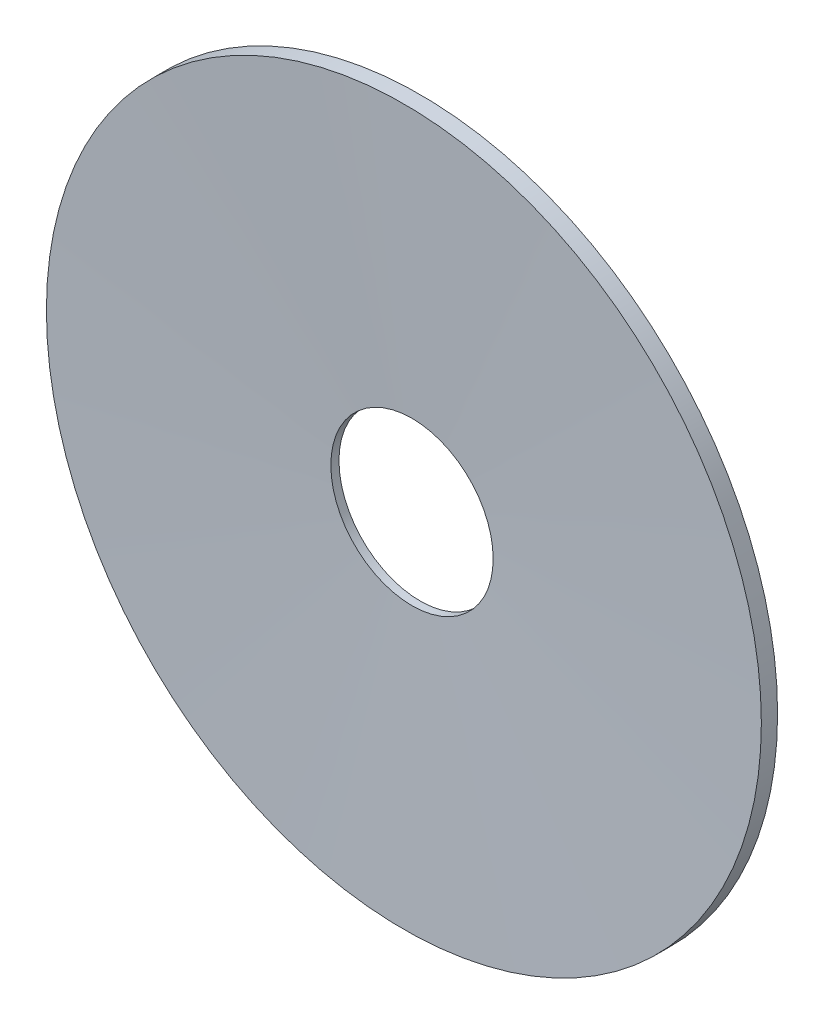
ISO-10303-21;
HEADER;
FILE_DESCRIPTION(('STEP AP214'),'2;1');
FILE_NAME('part.step','',(''),(''),'','','');
FILE_SCHEMA(('AUTOMOTIVE_DESIGN { 1 0 10303 214 1 1 1 1 }'));
ENDSEC;
DATA;
#1=APPLICATION_CONTEXT('core data for automotive mechanical design processes');
#2=APPLICATION_PROTOCOL_DEFINITION('international standard','automotive_design',2000,#1);
#3=PRODUCT_CONTEXT('',#1,'mechanical');
#4=PRODUCT('Part','Part','',(#3));
#5=PRODUCT_RELATED_PRODUCT_CATEGORY('part','',(#4));
#6=PRODUCT_DEFINITION_FORMATION('','',#4);
#7=PRODUCT_DEFINITION_CONTEXT('part definition',#1,'design');
#8=PRODUCT_DEFINITION('design','',#6,#7);
#9=PRODUCT_DEFINITION_SHAPE('','',#8);
#10=(LENGTH_UNIT() NAMED_UNIT(*) SI_UNIT(.MILLI.,.METRE.));
#11=(NAMED_UNIT(*) PLANE_ANGLE_UNIT() SI_UNIT($,.RADIAN.));
#12=(NAMED_UNIT(*) SI_UNIT($,.STERADIAN.) SOLID_ANGLE_UNIT());
#13=UNCERTAINTY_MEASURE_WITH_UNIT(LENGTH_MEASURE(1.E-05),#10,'distance_accuracy_value','');
#14=(GEOMETRIC_REPRESENTATION_CONTEXT(3) GLOBAL_UNCERTAINTY_ASSIGNED_CONTEXT((#13)) GLOBAL_UNIT_ASSIGNED_CONTEXT((#10,
#11,#12)) REPRESENTATION_CONTEXT('',''));
#15=CARTESIAN_POINT('',(0.,0.,0.));
#16=DIRECTION('',(0.,0.,1.));
#17=DIRECTION('',(1.,0.,0.));
#18=AXIS2_PLACEMENT_3D('',#15,#16,#17);
#19=CARTESIAN_POINT('',(0.,0.,4.));
#20=DIRECTION('',(0.,0.,-1.));
#21=DIRECTION('',(-1.,0.,0.));
#22=AXIS2_PLACEMENT_3D('',#19,#20,#21);
#23=CYLINDRICAL_SURFACE('',#22,88.1);
#24=CARTESIAN_POINT('',(0.,0.,3.99999999999999));
#25=DIRECTION('',(0.,0.,-1.));
#26=DIRECTION('',(-1.,0.,0.));
#27=AXIS2_PLACEMENT_3D('',#24,#25,#26);
#28=CIRCLE('',#27,88.1);
#29=CARTESIAN_POINT('',(88.0999999999999,0.,3.99999999999998));
#30=VERTEX_POINT('',#29);
#31=EDGE_CURVE('E37',#30,#30,#28,.T.);
#32=ORIENTED_EDGE('',*,*,#31,.T.);
#33=EDGE_LOOP('',(#32));
#34=FACE_BOUND('',#33,.T.);
#35=CARTESIAN_POINT('',(0.,0.,0.));
#36=DIRECTION('',(0.,0.,1.));
#37=DIRECTION('',(1.,0.,0.));
#38=AXIS2_PLACEMENT_3D('',#35,#36,#37);
#39=CIRCLE('',#38,88.1);
#40=CARTESIAN_POINT('',(88.1,0.,0.));
#41=VERTEX_POINT('',#40);
#42=EDGE_CURVE('E10',#41,#41,#39,.T.);
#43=ORIENTED_EDGE('',*,*,#42,.T.);
#44=EDGE_LOOP('',(#43));
#45=FACE_BOUND('',#44,.T.);
#46=ADVANCED_FACE('F31',(#34,#45),#23,.T.);
#47=CARTESIAN_POINT('',(0.,0.,0.));
#48=DIRECTION('',(0.,0.,1.));
#49=DIRECTION('',(1.,0.,0.));
#50=AXIS2_PLACEMENT_3D('',#47,#48,#49);
#51=PLANE('',#50);
#52=CARTESIAN_POINT('',(0.,0.,0.));
#53=DIRECTION('',(0.,0.,-1.));
#54=DIRECTION('',(-1.,0.,0.));
#55=AXIS2_PLACEMENT_3D('',#52,#53,#54);
#56=CIRCLE('',#55,20.);
#57=CARTESIAN_POINT('',(-20.,0.,0.));
#58=VERTEX_POINT('',#57);
#59=EDGE_CURVE('E45',#58,#58,#56,.T.);
#60=ORIENTED_EDGE('',*,*,#59,.F.);
#61=EDGE_LOOP('',(#60));
#62=FACE_BOUND('',#61,.T.);
#63=ORIENTED_EDGE('',*,*,#42,.F.);
#64=EDGE_LOOP('',(#63));
#65=FACE_BOUND('',#64,.T.);
#66=ADVANCED_FACE('F53',(#62,#65),#51,.F.);
#67=CARTESIAN_POINT('',(0.,0.,2.));
#68=DIRECTION('',(0.,0.,1.));
#69=DIRECTION('',(1.,0.,0.));
#70=AXIS2_PLACEMENT_3D('',#67,#68,#69);
#71=CONICAL_SURFACE('',#70,20.,1.54143619039893);
#72=CARTESIAN_POINT('',(0.,0.,2.));
#73=DIRECTION('',(0.,0.,-1.));
#74=DIRECTION('',(-1.,0.,0.));
#75=AXIS2_PLACEMENT_3D('',#72,#73,#74);
#76=CIRCLE('',#75,20.);
#77=CARTESIAN_POINT('',(20.,0.,2.));
#78=VERTEX_POINT('',#77);
#79=EDGE_CURVE('E41',#78,#78,#76,.T.);
#80=CARTESIAN_POINT('',(88.0999999999999,0.,3.99999999999998));
#81=CARTESIAN_POINT('',(87.3906249999999,0.,3.97916666666665));
#82=CARTESIAN_POINT('',(86.6812499999999,0.,3.95833333333331));
#83=CARTESIAN_POINT('',(85.2624999999999,0.,3.91666666666665));
#84=CARTESIAN_POINT('',(84.5531249999999,0.,3.89583333333331));
#85=CARTESIAN_POINT('',(83.1343749999999,0.,3.85416666666665));
#86=CARTESIAN_POINT('',(82.4249999999999,0.,3.83333333333331));
#87=CARTESIAN_POINT('',(81.0062499999999,0.,3.79166666666665));
#88=CARTESIAN_POINT('',(80.2968749999999,0.,3.77083333333331));
#89=CARTESIAN_POINT('',(78.8781249999999,0.,3.72916666666665));
#90=CARTESIAN_POINT('',(78.1687499999999,0.,3.70833333333331));
#91=CARTESIAN_POINT('',(76.7499999999999,0.,3.66666666666665));
#92=CARTESIAN_POINT('',(76.0406249999999,0.,3.64583333333332));
#93=CARTESIAN_POINT('',(74.6218749999999,0.,3.60416666666665));
#94=CARTESIAN_POINT('',(73.9124999999999,0.,3.58333333333332));
#95=CARTESIAN_POINT('',(72.4937499999999,0.,3.54166666666665));
#96=CARTESIAN_POINT('',(71.7843749999999,0.,3.52083333333332));
#97=CARTESIAN_POINT('',(70.365625,0.,3.47916666666665));
#98=CARTESIAN_POINT('',(69.6562499999999,0.,3.45833333333332));
#99=CARTESIAN_POINT('',(68.2374999999999,0.,3.41666666666665));
#100=CARTESIAN_POINT('',(67.5281249999999,0.,3.39583333333332));
#101=CARTESIAN_POINT('',(66.1093749999999,0.,3.35416666666665));
#102=CARTESIAN_POINT('',(65.3999999999999,0.,3.33333333333332));
#103=CARTESIAN_POINT('',(63.9812499999999,0.,3.29166666666665));
#104=CARTESIAN_POINT('',(63.2718749999999,0.,3.27083333333332));
#105=CARTESIAN_POINT('',(61.8531249999999,0.,3.22916666666665));
#106=CARTESIAN_POINT('',(61.1437499999999,0.,3.20833333333332));
#107=CARTESIAN_POINT('',(59.7249999999999,0.,3.16666666666665));
#108=CARTESIAN_POINT('',(59.015625,0.,3.14583333333332));
#109=CARTESIAN_POINT('',(57.596875,0.,3.10416666666665));
#110=CARTESIAN_POINT('',(56.8875,0.,3.08333333333332));
#111=CARTESIAN_POINT('',(55.46875,0.,3.04166666666665));
#112=CARTESIAN_POINT('',(54.759375,0.,3.02083333333332));
#113=CARTESIAN_POINT('',(53.340625,0.,2.97916666666665));
#114=CARTESIAN_POINT('',(52.63125,0.,2.95833333333332));
#115=CARTESIAN_POINT('',(51.2125,0.,2.91666666666665));
#116=CARTESIAN_POINT('',(50.503125,0.,2.89583333333332));
#117=CARTESIAN_POINT('',(49.084375,0.,2.85416666666665));
#118=CARTESIAN_POINT('',(48.375,0.,2.83333333333332));
#119=CARTESIAN_POINT('',(46.95625,0.,2.79166666666666));
#120=CARTESIAN_POINT('',(46.246875,0.,2.77083333333332));
#121=CARTESIAN_POINT('',(44.828125,0.,2.72916666666666));
#122=CARTESIAN_POINT('',(44.11875,0.,2.70833333333332));
#123=CARTESIAN_POINT('',(42.7,0.,2.66666666666666));
#124=CARTESIAN_POINT('',(41.990625,0.,2.64583333333332));
#125=CARTESIAN_POINT('',(40.571875,0.,2.60416666666666));
#126=CARTESIAN_POINT('',(39.8625,0.,2.58333333333332));
#127=CARTESIAN_POINT('',(38.44375,0.,2.54166666666666));
#128=CARTESIAN_POINT('',(37.734375,0.,2.52083333333332));
#129=CARTESIAN_POINT('',(36.315625,0.,2.47916666666666));
#130=CARTESIAN_POINT('',(35.60625,0.,2.45833333333333));
#131=CARTESIAN_POINT('',(34.1875,0.,2.41666666666666));
#132=CARTESIAN_POINT('',(33.478125,0.,2.39583333333333));
#133=CARTESIAN_POINT('',(32.059375,0.,2.35416666666666));
#134=CARTESIAN_POINT('',(31.35,0.,2.33333333333333));
#135=CARTESIAN_POINT('',(29.93125,0.,2.29166666666666));
#136=CARTESIAN_POINT('',(29.221875,0.,2.27083333333333));
#137=CARTESIAN_POINT('',(27.803125,0.,2.22916666666666));
#138=CARTESIAN_POINT('',(27.09375,0.,2.20833333333333));
#139=CARTESIAN_POINT('',(25.675,0.,2.16666666666666));
#140=CARTESIAN_POINT('',(24.965625,0.,2.14583333333333));
#141=CARTESIAN_POINT('',(23.546875,0.,2.10416666666666));
#142=CARTESIAN_POINT('',(22.8375,0.,2.08333333333333));
#143=CARTESIAN_POINT('',(21.41875,0.,2.04166666666666));
#144=CARTESIAN_POINT('',(20.709375,0.,2.02083333333333));
#145=CARTESIAN_POINT('',(20.,0.,2.));
#146=B_SPLINE_CURVE_WITH_KNOTS('',3,(#80,#81,#82,#83,#84,#85,#86,#87,#88,#89,#90,#91,#92,#93,
#94,#95,#96,#97,#98,#99,#100,#101,#102,#103,#104,#105,#106,#107,#108,#109,#110,#111,#112,#113,
#114,#115,#116,#117,#118,#119,#120,#121,#122,#123,#124,#125,#126,#127,#128,#129,#130,#131,#132,
#133,#134,#135,#136,#137,#138,#139,#140,#141,#142,#143,#144,#145),.UNSPECIFIED.,.F.,.F.,(4,2,2,
2,2,2,2,2,2,2,2,2,2,2,2,2,2,2,2,2,2,2,2,2,2,2,2,2,2,2,2,2,4),(0.,2.12904257017679,
4.25808514035357,6.38712771053037,8.51617028070715,10.6452128508839,12.7742554210607,
14.9032979912375,17.0323405614143,19.1613831315911,21.2904257017679,23.4194682719447,
25.5485108421215,27.6775534122982,29.806595982475,31.9356385526518,34.0646811228286,
36.1937236930054,38.3227662631822,40.451808833359,42.5808514035357,44.7098939737125,
46.8389365438893,48.9679791140661,51.0970216842429,53.2260642544197,55.3551068245965,
57.4841493947733,59.61319196495,61.7422345351268,63.8712771053036,66.0003196754804,
68.1293622456572),.UNSPECIFIED.);
#147=EDGE_CURVE('BSEAM56',#30,#78,#146,.T.);
#148=ORIENTED_EDGE('',*,*,#31,.F.);
#149=ORIENTED_EDGE('',*,*,#79,.T.);
#150=ORIENTED_EDGE('',*,*,#147,.T.);
#151=ORIENTED_EDGE('',*,*,#147,.F.);
#152=EDGE_LOOP('',(#148,#150,#149,#151));
#153=FACE_BOUND('',#152,.T.);
#154=ADVANCED_FACE('F56',(#153),#71,.F.);
#155=CARTESIAN_POINT('',(0.,0.,1.80492697246848));
#156=DIRECTION('',(0.,0.,-1.));
#157=DIRECTION('',(-1.,0.,0.));
#158=AXIS2_PLACEMENT_3D('',#155,#156,#157);
#159=CYLINDRICAL_SURFACE('',#158,20.);
#160=ORIENTED_EDGE('',*,*,#79,.F.);
#161=EDGE_LOOP('',(#160));
#162=FACE_BOUND('',#161,.T.);
#163=ORIENTED_EDGE('',*,*,#59,.T.);
#164=EDGE_LOOP('',(#163));
#165=FACE_BOUND('',#164,.T.);
#166=ADVANCED_FACE('F51',(#162,#165),#159,.F.);
#167=CLOSED_SHELL('',(#46,#66,#154,#166));
#168=MANIFOLD_SOLID_BREP('B2',#167);
#169=ADVANCED_BREP_SHAPE_REPRESENTATION('',(#18,#168),#14);
#170=SHAPE_DEFINITION_REPRESENTATION(#9,#169);
ENDSEC;
END-ISO-10303-21;
